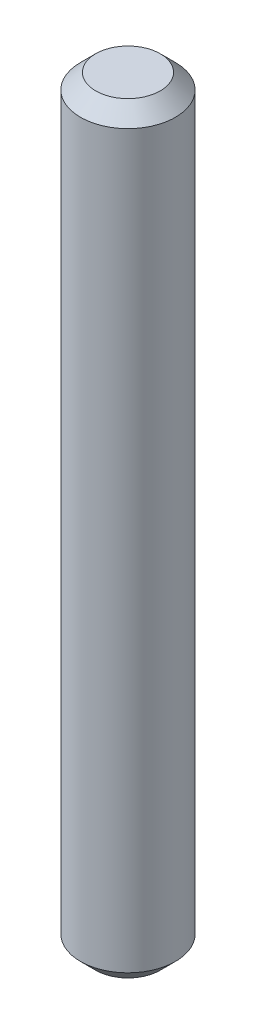
ISO-10303-21;
HEADER;
FILE_DESCRIPTION(('STEP AP214'),'2;1');
FILE_NAME('part.step','',(''),(''),'','','');
FILE_SCHEMA(('AUTOMOTIVE_DESIGN { 1 0 10303 214 1 1 1 1 }'));
ENDSEC;
DATA;
#1=APPLICATION_CONTEXT('core data for automotive mechanical design processes');
#2=APPLICATION_PROTOCOL_DEFINITION('international standard','automotive_design',2000,#1);
#3=PRODUCT_CONTEXT('',#1,'mechanical');
#4=PRODUCT('Part','Part','',(#3));
#5=PRODUCT_RELATED_PRODUCT_CATEGORY('part','',(#4));
#6=PRODUCT_DEFINITION_FORMATION('','',#4);
#7=PRODUCT_DEFINITION_CONTEXT('part definition',#1,'design');
#8=PRODUCT_DEFINITION('design','',#6,#7);
#9=PRODUCT_DEFINITION_SHAPE('','',#8);
#10=(LENGTH_UNIT() NAMED_UNIT(*) SI_UNIT(.MILLI.,.METRE.));
#11=(NAMED_UNIT(*) PLANE_ANGLE_UNIT() SI_UNIT($,.RADIAN.));
#12=(NAMED_UNIT(*) SI_UNIT($,.STERADIAN.) SOLID_ANGLE_UNIT());
#13=UNCERTAINTY_MEASURE_WITH_UNIT(LENGTH_MEASURE(1.E-05),#10,'distance_accuracy_value','');
#14=(GEOMETRIC_REPRESENTATION_CONTEXT(3) GLOBAL_UNCERTAINTY_ASSIGNED_CONTEXT((#13)) GLOBAL_UNIT_ASSIGNED_CONTEXT((#10,
#11,#12)) REPRESENTATION_CONTEXT('',''));
#15=CARTESIAN_POINT('',(0.,0.,0.));
#16=DIRECTION('',(0.,0.,1.));
#17=DIRECTION('',(1.,0.,0.));
#18=AXIS2_PLACEMENT_3D('',#15,#16,#17);
#19=CARTESIAN_POINT('',(0.,0.508000000000002,0.));
#20=DIRECTION('',(0.,1.,0.));
#21=DIRECTION('',(-1.,0.,0.));
#22=AXIS2_PLACEMENT_3D('',#19,#20,#21);
#23=CONICAL_SURFACE('',#22,1.5836899999933,0.785398163397448);
#24=CARTESIAN_POINT('',(0.,0.,0.));
#25=DIRECTION('',(0.,1.,0.));
#26=DIRECTION('',(-1.,0.,0.));
#27=AXIS2_PLACEMENT_3D('',#24,#25,#26);
#28=CIRCLE('',#27,1.0756899999933);
#29=CARTESIAN_POINT('',(-1.0756899999933,0.,0.));
#30=VERTEX_POINT('',#29);
#31=EDGE_CURVE('E44',#30,#30,#28,.T.);
#32=ORIENTED_EDGE('',*,*,#31,.T.);
#33=EDGE_LOOP('',(#32));
#34=FACE_BOUND('',#33,.T.);
#35=CARTESIAN_POINT('',(0.,0.508000000000002,0.));
#36=DIRECTION('',(0.,1.,0.));
#37=DIRECTION('',(-1.,0.,0.));
#38=AXIS2_PLACEMENT_3D('',#35,#36,#37);
#39=CIRCLE('',#38,1.5836899999933);
#40=CARTESIAN_POINT('',(-1.5836899999933,0.508000000000002,0.));
#41=VERTEX_POINT('',#40);
#42=EDGE_CURVE('E10',#41,#41,#39,.T.);
#43=ORIENTED_EDGE('',*,*,#42,.F.);
#44=EDGE_LOOP('',(#43));
#45=FACE_BOUND('',#44,.T.);
#46=ADVANCED_FACE('F30',(#34,#45),#23,.T.);
#47=CARTESIAN_POINT('',(0.,0.,0.));
#48=DIRECTION('',(0.,1.,0.));
#49=DIRECTION('',(-1.,0.,0.));
#50=AXIS2_PLACEMENT_3D('',#47,#48,#49);
#51=CYLINDRICAL_SURFACE('',#50,1.5836899999933);
#52=ORIENTED_EDGE('',*,*,#42,.T.);
#53=EDGE_LOOP('',(#52));
#54=FACE_BOUND('',#53,.T.);
#55=CARTESIAN_POINT('',(0.,24.8920000000407,0.));
#56=DIRECTION('',(0.,1.,0.));
#57=DIRECTION('',(-1.,0.,0.));
#58=AXIS2_PLACEMENT_3D('',#55,#56,#57);
#59=CIRCLE('',#58,1.58368999999331);
#60=CARTESIAN_POINT('',(-1.58368999999331,24.8920000000407,0.));
#61=VERTEX_POINT('',#60);
#62=EDGE_CURVE('E36',#61,#61,#59,.T.);
#63=ORIENTED_EDGE('',*,*,#62,.F.);
#64=EDGE_LOOP('',(#63));
#65=FACE_BOUND('',#64,.T.);
#66=ADVANCED_FACE('F63',(#54,#65),#51,.T.);
#67=CARTESIAN_POINT('',(0.,25.3999999999953,0.));
#68=DIRECTION('',(0.,-1.,0.));
#69=DIRECTION('',(1.,0.,0.));
#70=AXIS2_PLACEMENT_3D('',#67,#68,#69);
#71=CONICAL_SURFACE('',#70,1.07569000003872,0.785398163397449);
#72=ORIENTED_EDGE('',*,*,#62,.T.);
#73=EDGE_LOOP('',(#72));
#74=FACE_BOUND('',#73,.T.);
#75=CARTESIAN_POINT('',(0.,25.3999999999953,0.));
#76=DIRECTION('',(0.,1.,0.));
#77=DIRECTION('',(-1.,0.,0.));
#78=AXIS2_PLACEMENT_3D('',#75,#76,#77);
#79=CIRCLE('',#78,1.07569000003872);
#80=CARTESIAN_POINT('',(-1.07569000003872,25.3999999999953,0.));
#81=VERTEX_POINT('',#80);
#82=EDGE_CURVE('E40',#81,#81,#79,.T.);
#83=ORIENTED_EDGE('',*,*,#82,.F.);
#84=EDGE_LOOP('',(#83));
#85=FACE_BOUND('',#84,.T.);
#86=ADVANCED_FACE('F59',(#74,#85),#71,.T.);
#87=CARTESIAN_POINT('',(0.,25.3999999999953,0.));
#88=DIRECTION('',(0.,1.,0.));
#89=DIRECTION('',(-1.,0.,0.));
#90=AXIS2_PLACEMENT_3D('',#87,#88,#89);
#91=PLANE('',#90);
#92=ORIENTED_EDGE('',*,*,#82,.T.);
#93=EDGE_LOOP('',(#92));
#94=FACE_BOUND('',#93,.T.);
#95=ADVANCED_FACE('F54',(#94),#91,.T.);
#96=CARTESIAN_POINT('',(1.0756899999933,0.,0.));
#97=DIRECTION('',(0.,-1.,0.));
#98=DIRECTION('',(1.,0.,0.));
#99=AXIS2_PLACEMENT_3D('',#96,#97,#98);
#100=PLANE('',#99);
#101=ORIENTED_EDGE('',*,*,#31,.F.);
#102=EDGE_LOOP('',(#101));
#103=FACE_BOUND('',#102,.T.);
#104=ADVANCED_FACE('F52',(#103),#100,.T.);
#105=CLOSED_SHELL('',(#46,#66,#86,#95,#104));
#106=MANIFOLD_SOLID_BREP('B2',#105);
#107=ADVANCED_BREP_SHAPE_REPRESENTATION('',(#18,#106),#14);
#108=SHAPE_DEFINITION_REPRESENTATION(#9,#107);
ENDSEC;
END-ISO-10303-21;
